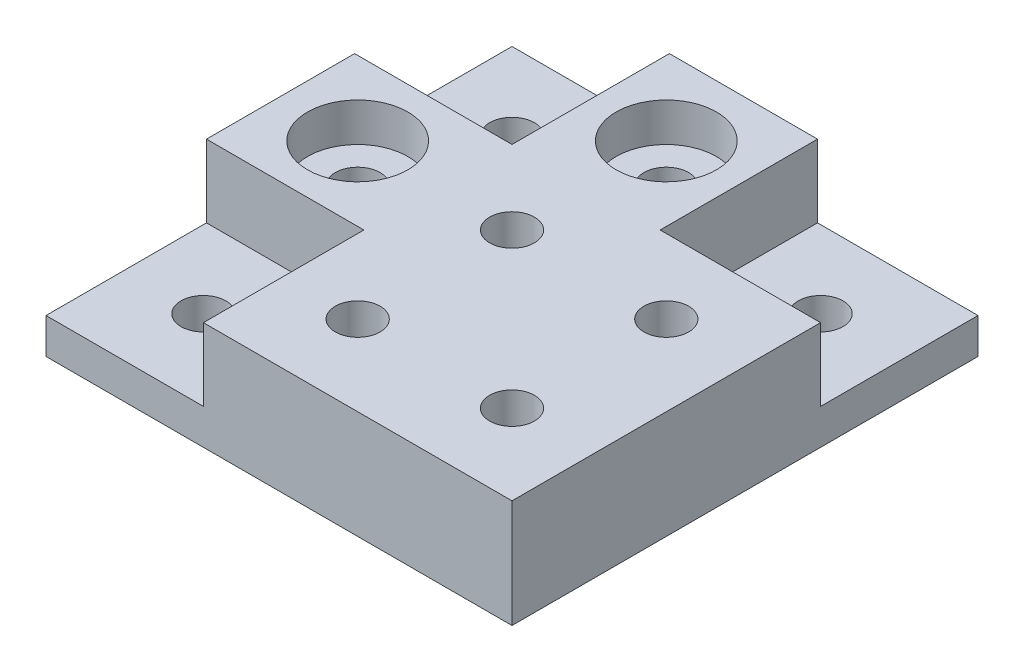
ISO-10303-21;
HEADER;
FILE_DESCRIPTION(('STEP AP214'),'2;1');
FILE_NAME('part.step','',(''),(''),'','','');
FILE_SCHEMA(('AUTOMOTIVE_DESIGN { 1 0 10303 214 1 1 1 1 }'));
ENDSEC;
DATA;
#1=APPLICATION_CONTEXT('core data for automotive mechanical design processes');
#2=APPLICATION_PROTOCOL_DEFINITION('international standard','automotive_design',2000,#1);
#3=PRODUCT_CONTEXT('',#1,'mechanical');
#4=PRODUCT('Part','Part','',(#3));
#5=PRODUCT_RELATED_PRODUCT_CATEGORY('part','',(#4));
#6=PRODUCT_DEFINITION_FORMATION('','',#4);
#7=PRODUCT_DEFINITION_CONTEXT('part definition',#1,'design');
#8=PRODUCT_DEFINITION('design','',#6,#7);
#9=PRODUCT_DEFINITION_SHAPE('','',#8);
#10=(LENGTH_UNIT() NAMED_UNIT(*) SI_UNIT(.MILLI.,.METRE.));
#11=(NAMED_UNIT(*) PLANE_ANGLE_UNIT() SI_UNIT($,.RADIAN.));
#12=(NAMED_UNIT(*) SI_UNIT($,.STERADIAN.) SOLID_ANGLE_UNIT());
#13=UNCERTAINTY_MEASURE_WITH_UNIT(LENGTH_MEASURE(1.E-05),#10,'distance_accuracy_value','');
#14=(GEOMETRIC_REPRESENTATION_CONTEXT(3) GLOBAL_UNCERTAINTY_ASSIGNED_CONTEXT((#13)) GLOBAL_UNIT_ASSIGNED_CONTEXT((#10,
#11,#12)) REPRESENTATION_CONTEXT('',''));
#15=CARTESIAN_POINT('',(0.,0.,0.));
#16=DIRECTION('',(0.,0.,1.));
#17=DIRECTION('',(1.,0.,0.));
#18=AXIS2_PLACEMENT_3D('',#15,#16,#17);
#19=CARTESIAN_POINT('',(-35.,0.,-45.));
#20=DIRECTION('',(0.,1.,0.));
#21=DIRECTION('',(0.,0.,1.));
#22=AXIS2_PLACEMENT_3D('',#19,#20,#21);
#23=CYLINDRICAL_SURFACE('',#22,1.45);
#24=CARTESIAN_POINT('',(-35.,0.,-45.));
#25=DIRECTION('',(0.,1.,0.));
#26=DIRECTION('',(0.,0.,1.));
#27=AXIS2_PLACEMENT_3D('',#24,#25,#26);
#28=CIRCLE('',#27,1.45);
#29=CARTESIAN_POINT('',(-35.,0.,-43.55));
#30=VERTEX_POINT('',#29);
#31=EDGE_CURVE('E187',#30,#30,#28,.T.);
#32=ORIENTED_EDGE('',*,*,#31,.F.);
#33=EDGE_LOOP('',(#32));
#34=FACE_BOUND('',#33,.T.);
#35=CARTESIAN_POINT('',(-35.,4.5,-45.));
#36=DIRECTION('',(0.,1.,0.));
#37=DIRECTION('',(0.,0.,1.));
#38=AXIS2_PLACEMENT_3D('',#35,#36,#37);
#39=CIRCLE('',#38,1.45);
#40=CARTESIAN_POINT('',(-35.,4.5,-43.55));
#41=VERTEX_POINT('',#40);
#42=EDGE_CURVE('E43',#41,#41,#39,.F.);
#43=ORIENTED_EDGE('',*,*,#42,.F.);
#44=EDGE_LOOP('',(#43));
#45=FACE_BOUND('',#44,.T.);
#46=ADVANCED_FACE('F39',(#34,#45),#23,.F.);
#47=CARTESIAN_POINT('',(-44.9999999999999,0.,-35.));
#48=DIRECTION('',(0.,1.,0.));
#49=DIRECTION('',(0.,0.,1.));
#50=AXIS2_PLACEMENT_3D('',#47,#48,#49);
#51=CYLINDRICAL_SURFACE('',#50,1.45);
#52=CARTESIAN_POINT('',(-44.9999999999999,0.,-35.));
#53=DIRECTION('',(0.,1.,0.));
#54=DIRECTION('',(0.,0.,1.));
#55=AXIS2_PLACEMENT_3D('',#52,#53,#54);
#56=CIRCLE('',#55,1.45);
#57=CARTESIAN_POINT('',(-44.9999999999999,0.,-33.55));
#58=VERTEX_POINT('',#57);
#59=EDGE_CURVE('E206',#58,#58,#56,.T.);
#60=ORIENTED_EDGE('',*,*,#59,.F.);
#61=EDGE_LOOP('',(#60));
#62=FACE_BOUND('',#61,.T.);
#63=CARTESIAN_POINT('',(-44.9999999999999,4.5,-35.));
#64=DIRECTION('',(0.,1.,0.));
#65=DIRECTION('',(0.,0.,1.));
#66=AXIS2_PLACEMENT_3D('',#63,#64,#65);
#67=CIRCLE('',#66,1.45);
#68=CARTESIAN_POINT('',(-44.9999999999999,4.5,-33.55));
#69=VERTEX_POINT('',#68);
#70=EDGE_CURVE('E181',#69,#69,#67,.F.);
#71=ORIENTED_EDGE('',*,*,#70,.F.);
#72=EDGE_LOOP('',(#71));
#73=FACE_BOUND('',#72,.T.);
#74=ADVANCED_FACE('F313',(#62,#73),#51,.F.);
#75=CARTESIAN_POINT('',(-50.,7.,-50.));
#76=DIRECTION('',(0.,0.,1.));
#77=DIRECTION('',(1.,0.,0.));
#78=AXIS2_PLACEMENT_3D('',#75,#76,#77);
#79=PLANE('',#78);
#80=DIRECTION('',(-1.,0.,0.));
#81=VECTOR('',#80,1.);
#82=CARTESIAN_POINT('',(-50.,2.3,-50.));
#83=LINE('',#82,#81);
#84=CARTESIAN_POINT('',(-19.8,2.3,-50.));
#85=VERTEX_POINT('',#84);
#86=CARTESIAN_POINT('',(-30.2,2.3,-50.));
#87=VERTEX_POINT('',#86);
#88=EDGE_CURVE('E11',#85,#87,#83,.T.);
#89=ORIENTED_EDGE('',*,*,#88,.F.);
#90=DIRECTION('',(0.,1.,0.));
#91=VECTOR('',#90,1.);
#92=CARTESIAN_POINT('',(-19.8,-8.,-50.));
#93=LINE('',#92,#91);
#94=CARTESIAN_POINT('',(-19.8,0.,-50.));
#95=VERTEX_POINT('',#94);
#96=EDGE_CURVE('E148',#95,#85,#93,.T.);
#97=ORIENTED_EDGE('',*,*,#96,.F.);
#98=DIRECTION('',(-1.,0.,0.));
#99=VECTOR('',#98,1.);
#100=CARTESIAN_POINT('',(-50.,0.,-50.));
#101=LINE('',#100,#99);
#102=CARTESIAN_POINT('',(-50.,0.,-50.));
#103=VERTEX_POINT('',#102);
#104=EDGE_CURVE('E275',#95,#103,#101,.T.);
#105=ORIENTED_EDGE('',*,*,#104,.T.);
#106=DIRECTION('',(0.,-1.,0.));
#107=VECTOR('',#106,1.);
#108=CARTESIAN_POINT('',(-50.,7.,-50.));
#109=LINE('',#108,#107);
#110=CARTESIAN_POINT('',(-50.,2.3,-50.));
#111=VERTEX_POINT('',#110);
#112=EDGE_CURVE('E283',#111,#103,#109,.T.);
#113=ORIENTED_EDGE('',*,*,#112,.F.);
#114=DIRECTION('',(-1.,0.,0.));
#115=VECTOR('',#114,1.);
#116=CARTESIAN_POINT('',(-50.,2.3,-50.));
#117=LINE('',#116,#115);
#118=CARTESIAN_POINT('',(-39.8,2.3,-50.));
#119=VERTEX_POINT('',#118);
#120=EDGE_CURVE('E273',#119,#111,#117,.T.);
#121=ORIENTED_EDGE('',*,*,#120,.F.);
#122=DIRECTION('',(0.,1.,0.));
#123=VECTOR('',#122,1.);
#124=CARTESIAN_POINT('',(-39.8,7.,-50.));
#125=LINE('',#124,#123);
#126=CARTESIAN_POINT('',(-39.8,7.,-50.));
#127=VERTEX_POINT('',#126);
#128=EDGE_CURVE('E264',#119,#127,#125,.T.);
#129=ORIENTED_EDGE('',*,*,#128,.T.);
#130=DIRECTION('',(-1.,0.,0.));
#131=VECTOR('',#130,1.);
#132=CARTESIAN_POINT('',(-50.,7.,-50.));
#133=LINE('',#132,#131);
#134=CARTESIAN_POINT('',(-30.2,7.,-50.));
#135=VERTEX_POINT('',#134);
#136=EDGE_CURVE('E276',#135,#127,#133,.T.);
#137=ORIENTED_EDGE('',*,*,#136,.F.);
#138=DIRECTION('',(0.,-1.,0.));
#139=VECTOR('',#138,1.);
#140=CARTESIAN_POINT('',(-30.2,7.,-50.));
#141=LINE('',#140,#139);
#142=EDGE_CURVE('E267',#135,#87,#141,.T.);
#143=ORIENTED_EDGE('',*,*,#142,.T.);
#144=EDGE_LOOP('',(#89,#97,#105,#113,#121,#129,#137,#143));
#145=FACE_BOUND('',#144,.T.);
#146=ADVANCED_FACE('F41',(#145),#79,.F.);
#147=CARTESIAN_POINT('',(-50.,7.,50.));
#148=DIRECTION('',(1.,0.,0.));
#149=DIRECTION('',(0.,0.,-1.));
#150=AXIS2_PLACEMENT_3D('',#147,#148,#149);
#151=PLANE('',#150);
#152=DIRECTION('',(0.,0.,1.));
#153=VECTOR('',#152,1.);
#154=CARTESIAN_POINT('',(-50.,0.,50.));
#155=LINE('',#154,#153);
#156=CARTESIAN_POINT('',(-50.,0.,-19.8));
#157=VERTEX_POINT('',#156);
#158=EDGE_CURVE('E280',#103,#157,#155,.T.);
#159=ORIENTED_EDGE('',*,*,#158,.T.);
#160=DIRECTION('',(0.,1.,0.));
#161=VECTOR('',#160,1.);
#162=CARTESIAN_POINT('',(-50.,-8.,-19.8));
#163=LINE('',#162,#161);
#164=CARTESIAN_POINT('',(-50.,2.3,-19.8));
#165=VERTEX_POINT('',#164);
#166=EDGE_CURVE('E147',#157,#165,#163,.T.);
#167=ORIENTED_EDGE('',*,*,#166,.T.);
#168=DIRECTION('',(0.,0.,1.));
#169=VECTOR('',#168,1.);
#170=CARTESIAN_POINT('',(-50.,2.3,50.));
#171=LINE('',#170,#169);
#172=CARTESIAN_POINT('',(-50.,2.3,-30.2));
#173=VERTEX_POINT('',#172);
#174=EDGE_CURVE('E48',#173,#165,#171,.T.);
#175=ORIENTED_EDGE('',*,*,#174,.F.);
#176=DIRECTION('',(0.,1.,0.));
#177=VECTOR('',#176,1.);
#178=CARTESIAN_POINT('',(-50.,7.,-30.2));
#179=LINE('',#178,#177);
#180=CARTESIAN_POINT('',(-50.,7.,-30.2));
#181=VERTEX_POINT('',#180);
#182=EDGE_CURVE('E270',#173,#181,#179,.T.);
#183=ORIENTED_EDGE('',*,*,#182,.T.);
#184=DIRECTION('',(0.,0.,1.));
#185=VECTOR('',#184,1.);
#186=CARTESIAN_POINT('',(-50.,7.,50.));
#187=LINE('',#186,#185);
#188=CARTESIAN_POINT('',(-50.,7.,-39.8));
#189=VERTEX_POINT('',#188);
#190=EDGE_CURVE('E279',#189,#181,#187,.T.);
#191=ORIENTED_EDGE('',*,*,#190,.F.);
#192=DIRECTION('',(0.,-1.,0.));
#193=VECTOR('',#192,1.);
#194=CARTESIAN_POINT('',(-50.,7.,-39.8));
#195=LINE('',#194,#193);
#196=CARTESIAN_POINT('',(-50.,2.3,-39.8));
#197=VERTEX_POINT('',#196);
#198=EDGE_CURVE('E64',#189,#197,#195,.T.);
#199=ORIENTED_EDGE('',*,*,#198,.T.);
#200=DIRECTION('',(0.,0.,1.));
#201=VECTOR('',#200,1.);
#202=CARTESIAN_POINT('',(-50.,2.3,50.));
#203=LINE('',#202,#201);
#204=EDGE_CURVE('E294',#111,#197,#203,.T.);
#205=ORIENTED_EDGE('',*,*,#204,.F.);
#206=ORIENTED_EDGE('',*,*,#112,.T.);
#207=EDGE_LOOP('',(#159,#167,#175,#183,#191,#199,#205,#206));
#208=FACE_BOUND('',#207,.T.);
#209=ADVANCED_FACE('F382',(#208),#151,.F.);
#210=CARTESIAN_POINT('',(0.,7.,0.));
#211=DIRECTION('',(0.,-1.,0.));
#212=DIRECTION('',(0.,0.,-1.));
#213=AXIS2_PLACEMENT_3D('',#210,#211,#212);
#214=PLANE('',#213);
#215=CARTESIAN_POINT('',(-44.9999999999999,7.,-35.));
#216=DIRECTION('',(0.,1.,0.));
#217=DIRECTION('',(0.,0.,1.));
#218=AXIS2_PLACEMENT_3D('',#215,#216,#217);
#219=CIRCLE('',#218,3.25);
#220=CARTESIAN_POINT('',(-44.9999999999999,7.,-31.75));
#221=VERTEX_POINT('',#220);
#222=EDGE_CURVE('E172',#221,#221,#219,.T.);
#223=ORIENTED_EDGE('',*,*,#222,.F.);
#224=EDGE_LOOP('',(#223));
#225=FACE_BOUND('',#224,.T.);
#226=CARTESIAN_POINT('',(-35.,7.,-45.));
#227=DIRECTION('',(0.,1.,0.));
#228=DIRECTION('',(0.,0.,1.));
#229=AXIS2_PLACEMENT_3D('',#226,#227,#228);
#230=CIRCLE('',#229,3.25);
#231=CARTESIAN_POINT('',(-35.,7.,-41.75));
#232=VERTEX_POINT('',#231);
#233=EDGE_CURVE('E178',#232,#232,#230,.T.);
#234=ORIENTED_EDGE('',*,*,#233,.F.);
#235=EDGE_LOOP('',(#234));
#236=FACE_BOUND('',#235,.T.);
#237=CARTESIAN_POINT('',(-34.9999999999998,7.,-25.));
#238=DIRECTION('',(0.,1.,0.));
#239=DIRECTION('',(0.,0.,1.));
#240=AXIS2_PLACEMENT_3D('',#237,#238,#239);
#241=CIRCLE('',#240,1.45);
#242=CARTESIAN_POINT('',(-34.9999999999998,7.,-23.55));
#243=VERTEX_POINT('',#242);
#244=EDGE_CURVE('E210',#243,#243,#241,.T.);
#245=ORIENTED_EDGE('',*,*,#244,.F.);
#246=EDGE_LOOP('',(#245));
#247=FACE_BOUND('',#246,.T.);
#248=CARTESIAN_POINT('',(-24.9999999999998,7.,-25.));
#249=DIRECTION('',(0.,1.,0.));
#250=DIRECTION('',(0.,0.,1.));
#251=AXIS2_PLACEMENT_3D('',#248,#249,#250);
#252=CIRCLE('',#251,1.45);
#253=CARTESIAN_POINT('',(-24.9999999999998,7.,-23.55));
#254=VERTEX_POINT('',#253);
#255=EDGE_CURVE('E203',#254,#254,#252,.T.);
#256=ORIENTED_EDGE('',*,*,#255,.F.);
#257=EDGE_LOOP('',(#256));
#258=FACE_BOUND('',#257,.T.);
#259=CARTESIAN_POINT('',(-34.9999999999999,7.,-35.));
#260=DIRECTION('',(0.,1.,0.));
#261=DIRECTION('',(0.,0.,1.));
#262=AXIS2_PLACEMENT_3D('',#259,#260,#261);
#263=CIRCLE('',#262,1.45);
#264=CARTESIAN_POINT('',(-34.9999999999999,7.,-33.55));
#265=VERTEX_POINT('',#264);
#266=EDGE_CURVE('E191',#265,#265,#263,.T.);
#267=ORIENTED_EDGE('',*,*,#266,.F.);
#268=EDGE_LOOP('',(#267));
#269=FACE_BOUND('',#268,.T.);
#270=CARTESIAN_POINT('',(-24.9999999999999,7.,-35.));
#271=DIRECTION('',(0.,1.,0.));
#272=DIRECTION('',(0.,0.,1.));
#273=AXIS2_PLACEMENT_3D('',#270,#271,#272);
#274=CIRCLE('',#273,1.45);
#275=CARTESIAN_POINT('',(-24.9999999999999,7.,-33.55));
#276=VERTEX_POINT('',#275);
#277=EDGE_CURVE('E184',#276,#276,#274,.T.);
#278=ORIENTED_EDGE('',*,*,#277,.F.);
#279=EDGE_LOOP('',(#278));
#280=FACE_BOUND('',#279,.T.);
#281=DIRECTION('',(0.,0.,-1.));
#282=VECTOR('',#281,1.);
#283=CARTESIAN_POINT('',(-39.7999999999998,7.,-30.2));
#284=LINE('',#283,#282);
#285=CARTESIAN_POINT('',(-39.7999999999998,7.,-19.8));
#286=VERTEX_POINT('',#285);
#287=CARTESIAN_POINT('',(-39.7999999999998,7.,-30.2));
#288=VERTEX_POINT('',#287);
#289=EDGE_CURVE('E162',#286,#288,#284,.T.);
#290=ORIENTED_EDGE('',*,*,#289,.F.);
#291=DIRECTION('',(-1.,0.,0.));
#292=VECTOR('',#291,1.);
#293=CARTESIAN_POINT('',(-50.,7.,-19.8));
#294=LINE('',#293,#292);
#295=CARTESIAN_POINT('',(-19.8,7.,-19.8));
#296=VERTEX_POINT('',#295);
#297=EDGE_CURVE('E141',#296,#286,#294,.T.);
#298=ORIENTED_EDGE('',*,*,#297,.F.);
#299=DIRECTION('',(0.,0.,1.));
#300=VECTOR('',#299,1.);
#301=CARTESIAN_POINT('',(-19.8,7.,-50.));
#302=LINE('',#301,#300);
#303=CARTESIAN_POINT('',(-19.8,7.,-39.8));
#304=VERTEX_POINT('',#303);
#305=EDGE_CURVE('E151',#304,#296,#302,.T.);
#306=ORIENTED_EDGE('',*,*,#305,.F.);
#307=DIRECTION('',(1.,0.,0.));
#308=VECTOR('',#307,1.);
#309=CARTESIAN_POINT('',(-30.2,7.,-39.8));
#310=LINE('',#309,#308);
#311=CARTESIAN_POINT('',(-30.2,7.,-39.8));
#312=VERTEX_POINT('',#311);
#313=EDGE_CURVE('E227',#312,#304,#310,.T.);
#314=ORIENTED_EDGE('',*,*,#313,.F.);
#315=DIRECTION('',(0.,0.,-1.));
#316=VECTOR('',#315,1.);
#317=CARTESIAN_POINT('',(-30.2,7.,0.));
#318=LINE('',#317,#316);
#319=EDGE_CURVE('E291',#312,#135,#318,.T.);
#320=ORIENTED_EDGE('',*,*,#319,.T.);
#321=ORIENTED_EDGE('',*,*,#136,.T.);
#322=DIRECTION('',(0.,0.,-1.));
#323=VECTOR('',#322,1.);
#324=CARTESIAN_POINT('',(-39.8,7.,-50.2));
#325=LINE('',#324,#323);
#326=CARTESIAN_POINT('',(-39.8,7.,-39.8));
#327=VERTEX_POINT('',#326);
#328=EDGE_CURVE('E229',#327,#127,#325,.T.);
#329=ORIENTED_EDGE('',*,*,#328,.F.);
#330=DIRECTION('',(-1.,0.,0.));
#331=VECTOR('',#330,1.);
#332=CARTESIAN_POINT('',(0.,7.,-39.8));
#333=LINE('',#332,#331);
#334=EDGE_CURVE('E289',#327,#189,#333,.T.);
#335=ORIENTED_EDGE('',*,*,#334,.T.);
#336=ORIENTED_EDGE('',*,*,#190,.T.);
#337=DIRECTION('',(-1.,0.,0.));
#338=VECTOR('',#337,1.);
#339=CARTESIAN_POINT('',(-50.1999999999998,7.,-30.2));
#340=LINE('',#339,#338);
#341=EDGE_CURVE('E243',#288,#181,#340,.T.);
#342=ORIENTED_EDGE('',*,*,#341,.F.);
#343=EDGE_LOOP('',(#290,#298,#306,#314,#320,#321,#329,#335,#336,#342));
#344=FACE_BOUND('',#343,.T.);
#345=ADVANCED_FACE('F159',(#225,#236,#247,#258,#269,#280,#344),#214,.F.);
#346=CARTESIAN_POINT('',(0.,0.,0.));
#347=DIRECTION('',(0.,-1.,0.));
#348=DIRECTION('',(0.,0.,-1.));
#349=AXIS2_PLACEMENT_3D('',#346,#347,#348);
#350=PLANE('',#349);
#351=DIRECTION('',(1.,0.,0.));
#352=VECTOR('',#351,1.);
#353=CARTESIAN_POINT('',(0.,0.,-19.8));
#354=LINE('',#353,#352);
#355=CARTESIAN_POINT('',(-19.8,0.,-19.8));
#356=VERTEX_POINT('',#355);
#357=EDGE_CURVE('E144',#157,#356,#354,.T.);
#358=ORIENTED_EDGE('',*,*,#357,.F.);
#359=ORIENTED_EDGE('',*,*,#158,.F.);
#360=ORIENTED_EDGE('',*,*,#104,.F.);
#361=DIRECTION('',(0.,0.,-1.));
#362=VECTOR('',#361,1.);
#363=CARTESIAN_POINT('',(-19.8,0.,0.));
#364=LINE('',#363,#362);
#365=EDGE_CURVE('E169',#356,#95,#364,.T.);
#366=ORIENTED_EDGE('',*,*,#365,.F.);
#367=EDGE_LOOP('',(#358,#359,#360,#366));
#368=FACE_BOUND('',#367,.T.);
#369=CARTESIAN_POINT('',(-34.9999999999998,0.,-25.));
#370=DIRECTION('',(0.,1.,0.));
#371=DIRECTION('',(0.,0.,1.));
#372=AXIS2_PLACEMENT_3D('',#369,#370,#371);
#373=CIRCLE('',#372,1.45);
#374=CARTESIAN_POINT('',(-34.9999999999998,0.,-23.55));
#375=VERTEX_POINT('',#374);
#376=EDGE_CURVE('E200',#375,#375,#373,.T.);
#377=ORIENTED_EDGE('',*,*,#376,.T.);
#378=EDGE_LOOP('',(#377));
#379=FACE_BOUND('',#378,.T.);
#380=CARTESIAN_POINT('',(-24.9999999999998,0.,-25.));
#381=DIRECTION('',(0.,1.,0.));
#382=DIRECTION('',(0.,0.,1.));
#383=AXIS2_PLACEMENT_3D('',#380,#381,#382);
#384=CIRCLE('',#383,1.45);
#385=CARTESIAN_POINT('',(-24.9999999999998,0.,-23.55));
#386=VERTEX_POINT('',#385);
#387=EDGE_CURVE('E207',#386,#386,#384,.T.);
#388=ORIENTED_EDGE('',*,*,#387,.T.);
#389=EDGE_LOOP('',(#388));
#390=FACE_BOUND('',#389,.T.);
#391=CARTESIAN_POINT('',(-44.9999999999998,0.,-25.));
#392=DIRECTION('',(0.,1.,0.));
#393=DIRECTION('',(0.,0.,1.));
#394=AXIS2_PLACEMENT_3D('',#391,#392,#393);
#395=CIRCLE('',#394,1.45);
#396=CARTESIAN_POINT('',(-44.9999999999998,0.,-23.55));
#397=VERTEX_POINT('',#396);
#398=EDGE_CURVE('E215',#397,#397,#395,.T.);
#399=ORIENTED_EDGE('',*,*,#398,.T.);
#400=EDGE_LOOP('',(#399));
#401=FACE_BOUND('',#400,.T.);
#402=ORIENTED_EDGE('',*,*,#59,.T.);
#403=EDGE_LOOP('',(#402));
#404=FACE_BOUND('',#403,.T.);
#405=CARTESIAN_POINT('',(-25.,0.,-45.));
#406=DIRECTION('',(0.,1.,0.));
#407=DIRECTION('',(0.,0.,1.));
#408=AXIS2_PLACEMENT_3D('',#405,#406,#407);
#409=CIRCLE('',#408,1.45);
#410=CARTESIAN_POINT('',(-25.,0.,-43.55));
#411=VERTEX_POINT('',#410);
#412=EDGE_CURVE('E197',#411,#411,#409,.T.);
#413=ORIENTED_EDGE('',*,*,#412,.T.);
#414=EDGE_LOOP('',(#413));
#415=FACE_BOUND('',#414,.T.);
#416=ORIENTED_EDGE('',*,*,#31,.T.);
#417=EDGE_LOOP('',(#416));
#418=FACE_BOUND('',#417,.T.);
#419=CARTESIAN_POINT('',(-34.9999999999999,0.,-35.));
#420=DIRECTION('',(0.,1.,0.));
#421=DIRECTION('',(0.,0.,1.));
#422=AXIS2_PLACEMENT_3D('',#419,#420,#421);
#423=CIRCLE('',#422,1.45);
#424=CARTESIAN_POINT('',(-34.9999999999999,0.,-33.55));
#425=VERTEX_POINT('',#424);
#426=EDGE_CURVE('E194',#425,#425,#423,.T.);
#427=ORIENTED_EDGE('',*,*,#426,.T.);
#428=EDGE_LOOP('',(#427));
#429=FACE_BOUND('',#428,.T.);
#430=CARTESIAN_POINT('',(-24.9999999999999,0.,-35.));
#431=DIRECTION('',(0.,1.,0.));
#432=DIRECTION('',(0.,0.,1.));
#433=AXIS2_PLACEMENT_3D('',#430,#431,#432);
#434=CIRCLE('',#433,1.45);
#435=CARTESIAN_POINT('',(-24.9999999999999,0.,-33.55));
#436=VERTEX_POINT('',#435);
#437=EDGE_CURVE('E188',#436,#436,#434,.T.);
#438=ORIENTED_EDGE('',*,*,#437,.T.);
#439=EDGE_LOOP('',(#438));
#440=FACE_BOUND('',#439,.T.);
#441=CARTESIAN_POINT('',(-45.,0.,-45.));
#442=DIRECTION('',(0.,1.,0.));
#443=DIRECTION('',(0.,0.,1.));
#444=AXIS2_PLACEMENT_3D('',#441,#442,#443);
#445=CIRCLE('',#444,1.45);
#446=CARTESIAN_POINT('',(-45.,0.,-43.55));
#447=VERTEX_POINT('',#446);
#448=EDGE_CURVE('E218',#447,#447,#445,.T.);
#449=ORIENTED_EDGE('',*,*,#448,.T.);
#450=EDGE_LOOP('',(#449));
#451=FACE_BOUND('',#450,.T.);
#452=ADVANCED_FACE('F373',(#368,#379,#390,#401,#404,#415,#418,#429,#440,#451),#350,.T.);
#453=CARTESIAN_POINT('',(0.,2.3,0.));
#454=DIRECTION('',(0.,1.,0.));
#455=DIRECTION('',(0.,0.,1.));
#456=AXIS2_PLACEMENT_3D('',#453,#454,#455);
#457=PLANE('',#456);
#458=CARTESIAN_POINT('',(-45.,2.3,-45.));
#459=DIRECTION('',(0.,1.,0.));
#460=DIRECTION('',(0.,0.,1.));
#461=AXIS2_PLACEMENT_3D('',#458,#459,#460);
#462=CIRCLE('',#461,1.45);
#463=CARTESIAN_POINT('',(-45.,2.3,-43.55));
#464=VERTEX_POINT('',#463);
#465=EDGE_CURVE('E242',#464,#464,#462,.T.);
#466=ORIENTED_EDGE('',*,*,#465,.F.);
#467=EDGE_LOOP('',(#466));
#468=FACE_BOUND('',#467,.T.);
#469=ORIENTED_EDGE('',*,*,#120,.T.);
#470=ORIENTED_EDGE('',*,*,#204,.T.);
#471=DIRECTION('',(1.,0.,0.));
#472=VECTOR('',#471,1.);
#473=CARTESIAN_POINT('',(-50.2,2.3,-39.8));
#474=LINE('',#473,#472);
#475=CARTESIAN_POINT('',(-39.8,2.3,-39.8));
#476=VERTEX_POINT('',#475);
#477=EDGE_CURVE('E254',#197,#476,#474,.T.);
#478=ORIENTED_EDGE('',*,*,#477,.T.);
#479=DIRECTION('',(0.,0.,-1.));
#480=VECTOR('',#479,1.);
#481=CARTESIAN_POINT('',(-39.8,2.3,-50.2));
#482=LINE('',#481,#480);
#483=EDGE_CURVE('E256',#476,#119,#482,.T.);
#484=ORIENTED_EDGE('',*,*,#483,.T.);
#485=EDGE_LOOP('',(#469,#470,#478,#484));
#486=FACE_BOUND('',#485,.T.);
#487=ADVANCED_FACE('F369',(#468,#486),#457,.T.);
#488=CARTESIAN_POINT('',(-39.8,2.3,-50.2));
#489=DIRECTION('',(1.,0.,0.));
#490=DIRECTION('',(0.,0.,-1.));
#491=AXIS2_PLACEMENT_3D('',#488,#489,#490);
#492=PLANE('',#491);
#493=ORIENTED_EDGE('',*,*,#483,.F.);
#494=DIRECTION('',(0.,1.,0.));
#495=VECTOR('',#494,1.);
#496=CARTESIAN_POINT('',(-39.8,2.3,-39.8));
#497=LINE('',#496,#495);
#498=EDGE_CURVE('E259',#476,#327,#497,.T.);
#499=ORIENTED_EDGE('',*,*,#498,.T.);
#500=ORIENTED_EDGE('',*,*,#328,.T.);
#501=ORIENTED_EDGE('',*,*,#128,.F.);
#502=EDGE_LOOP('',(#493,#499,#500,#501));
#503=FACE_BOUND('',#502,.T.);
#504=ADVANCED_FACE('F372',(#503),#492,.F.);
#505=CARTESIAN_POINT('',(-50.2,2.3,-39.8));
#506=DIRECTION('',(0.,0.,1.));
#507=DIRECTION('',(1.,0.,0.));
#508=AXIS2_PLACEMENT_3D('',#505,#506,#507);
#509=PLANE('',#508);
#510=ORIENTED_EDGE('',*,*,#334,.F.);
#511=ORIENTED_EDGE('',*,*,#498,.F.);
#512=ORIENTED_EDGE('',*,*,#477,.F.);
#513=ORIENTED_EDGE('',*,*,#198,.F.);
#514=EDGE_LOOP('',(#510,#511,#512,#513));
#515=FACE_BOUND('',#514,.T.);
#516=ADVANCED_FACE('F357',(#515),#509,.F.);
#517=CARTESIAN_POINT('',(0.,2.3,0.));
#518=DIRECTION('',(0.,1.,0.));
#519=DIRECTION('',(0.,0.,1.));
#520=AXIS2_PLACEMENT_3D('',#517,#518,#519);
#521=PLANE('',#520);
#522=CARTESIAN_POINT('',(-25.,2.3,-45.));
#523=DIRECTION('',(0.,1.,0.));
#524=DIRECTION('',(0.,0.,1.));
#525=AXIS2_PLACEMENT_3D('',#522,#523,#524);
#526=CIRCLE('',#525,1.45);
#527=CARTESIAN_POINT('',(-25.,2.3,-43.55));
#528=VERTEX_POINT('',#527);
#529=EDGE_CURVE('E300',#528,#528,#526,.T.);
#530=ORIENTED_EDGE('',*,*,#529,.F.);
#531=EDGE_LOOP('',(#530));
#532=FACE_BOUND('',#531,.T.);
#533=ORIENTED_EDGE('',*,*,#88,.T.);
#534=DIRECTION('',(0.,0.,1.));
#535=VECTOR('',#534,1.);
#536=CARTESIAN_POINT('',(-30.2,2.3,-50.2));
#537=LINE('',#536,#535);
#538=CARTESIAN_POINT('',(-30.2,2.3,-39.8));
#539=VERTEX_POINT('',#538);
#540=EDGE_CURVE('E230',#87,#539,#537,.T.);
#541=ORIENTED_EDGE('',*,*,#540,.T.);
#542=DIRECTION('',(1.,0.,0.));
#543=VECTOR('',#542,1.);
#544=CARTESIAN_POINT('',(-30.2,2.3,-39.8));
#545=LINE('',#544,#543);
#546=CARTESIAN_POINT('',(-19.8,2.3,-39.8));
#547=VERTEX_POINT('',#546);
#548=EDGE_CURVE('E233',#539,#547,#545,.T.);
#549=ORIENTED_EDGE('',*,*,#548,.T.);
#550=DIRECTION('',(0.,0.,-1.));
#551=VECTOR('',#550,1.);
#552=CARTESIAN_POINT('',(-19.8,2.3,-50.2));
#553=LINE('',#552,#551);
#554=EDGE_CURVE('E225',#547,#85,#553,.T.);
#555=ORIENTED_EDGE('',*,*,#554,.T.);
#556=EDGE_LOOP('',(#533,#541,#549,#555));
#557=FACE_BOUND('',#556,.T.);
#558=ADVANCED_FACE('F350',(#532,#557),#521,.T.);
#559=CARTESIAN_POINT('',(-30.2,2.3,-50.2));
#560=DIRECTION('',(-1.,0.,0.));
#561=DIRECTION('',(0.,0.,1.));
#562=AXIS2_PLACEMENT_3D('',#559,#560,#561);
#563=PLANE('',#562);
#564=ORIENTED_EDGE('',*,*,#319,.F.);
#565=DIRECTION('',(0.,1.,0.));
#566=VECTOR('',#565,1.);
#567=CARTESIAN_POINT('',(-30.2,2.3,-39.8));
#568=LINE('',#567,#566);
#569=EDGE_CURVE('E56',#539,#312,#568,.T.);
#570=ORIENTED_EDGE('',*,*,#569,.F.);
#571=ORIENTED_EDGE('',*,*,#540,.F.);
#572=ORIENTED_EDGE('',*,*,#142,.F.);
#573=EDGE_LOOP('',(#564,#570,#571,#572));
#574=FACE_BOUND('',#573,.T.);
#575=ADVANCED_FACE('F346',(#574),#563,.F.);
#576=CARTESIAN_POINT('',(-30.2,2.3,-39.8));
#577=DIRECTION('',(0.,0.,1.));
#578=DIRECTION('',(1.,0.,0.));
#579=AXIS2_PLACEMENT_3D('',#576,#577,#578);
#580=PLANE('',#579);
#581=ORIENTED_EDGE('',*,*,#313,.T.);
#582=DIRECTION('',(0.,1.,0.));
#583=VECTOR('',#582,1.);
#584=CARTESIAN_POINT('',(-19.8,2.3,-39.8));
#585=LINE('',#584,#583);
#586=EDGE_CURVE('E154',#547,#304,#585,.T.);
#587=ORIENTED_EDGE('',*,*,#586,.F.);
#588=ORIENTED_EDGE('',*,*,#548,.F.);
#589=ORIENTED_EDGE('',*,*,#569,.T.);
#590=EDGE_LOOP('',(#581,#587,#588,#589));
#591=FACE_BOUND('',#590,.T.);
#592=ADVANCED_FACE('F349',(#591),#580,.F.);
#593=CARTESIAN_POINT('',(0.,2.3,0.));
#594=DIRECTION('',(0.,1.,0.));
#595=DIRECTION('',(0.,0.,1.));
#596=AXIS2_PLACEMENT_3D('',#593,#594,#595);
#597=PLANE('',#596);
#598=CARTESIAN_POINT('',(-44.9999999999998,2.3,-25.));
#599=DIRECTION('',(0.,1.,0.));
#600=DIRECTION('',(0.,0.,1.));
#601=AXIS2_PLACEMENT_3D('',#598,#599,#600);
#602=CIRCLE('',#601,1.45);
#603=CARTESIAN_POINT('',(-44.9999999999998,2.3,-23.55));
#604=VERTEX_POINT('',#603);
#605=EDGE_CURVE('E223',#604,#604,#602,.T.);
#606=ORIENTED_EDGE('',*,*,#605,.F.);
#607=EDGE_LOOP('',(#606));
#608=FACE_BOUND('',#607,.T.);
#609=ORIENTED_EDGE('',*,*,#174,.T.);
#610=DIRECTION('',(1.,0.,0.));
#611=VECTOR('',#610,1.);
#612=CARTESIAN_POINT('',(-50.1999999999998,2.3,-19.8));
#613=LINE('',#612,#611);
#614=CARTESIAN_POINT('',(-39.7999999999998,2.3,-19.8));
#615=VERTEX_POINT('',#614);
#616=EDGE_CURVE('E245',#165,#615,#613,.T.);
#617=ORIENTED_EDGE('',*,*,#616,.T.);
#618=DIRECTION('',(0.,0.,-1.));
#619=VECTOR('',#618,1.);
#620=CARTESIAN_POINT('',(-39.7999999999998,2.3,-30.2));
#621=LINE('',#620,#619);
#622=CARTESIAN_POINT('',(-39.7999999999998,2.3,-30.2));
#623=VERTEX_POINT('',#622);
#624=EDGE_CURVE('E249',#615,#623,#621,.T.);
#625=ORIENTED_EDGE('',*,*,#624,.T.);
#626=DIRECTION('',(-1.,0.,0.));
#627=VECTOR('',#626,1.);
#628=CARTESIAN_POINT('',(-50.1999999999998,2.3,-30.2));
#629=LINE('',#628,#627);
#630=EDGE_CURVE('E239',#623,#173,#629,.T.);
#631=ORIENTED_EDGE('',*,*,#630,.T.);
#632=EDGE_LOOP('',(#609,#617,#625,#631));
#633=FACE_BOUND('',#632,.T.);
#634=ADVANCED_FACE('F354',(#608,#633),#597,.T.);
#635=CARTESIAN_POINT('',(-50.1999999999998,2.3,-30.2));
#636=DIRECTION('',(0.,0.,-1.));
#637=DIRECTION('',(-1.,0.,0.));
#638=AXIS2_PLACEMENT_3D('',#635,#636,#637);
#639=PLANE('',#638);
#640=ORIENTED_EDGE('',*,*,#630,.F.);
#641=DIRECTION('',(0.,1.,0.));
#642=VECTOR('',#641,1.);
#643=CARTESIAN_POINT('',(-39.7999999999998,2.3,-30.2));
#644=LINE('',#643,#642);
#645=EDGE_CURVE('E240',#623,#288,#644,.T.);
#646=ORIENTED_EDGE('',*,*,#645,.T.);
#647=ORIENTED_EDGE('',*,*,#341,.T.);
#648=ORIENTED_EDGE('',*,*,#182,.F.);
#649=EDGE_LOOP('',(#640,#646,#647,#648));
#650=FACE_BOUND('',#649,.T.);
#651=ADVANCED_FACE('F361',(#650),#639,.F.);
#652=CARTESIAN_POINT('',(-39.7999999999998,2.3,-30.2));
#653=DIRECTION('',(1.,0.,0.));
#654=DIRECTION('',(0.,0.,-1.));
#655=AXIS2_PLACEMENT_3D('',#652,#653,#654);
#656=PLANE('',#655);
#657=ORIENTED_EDGE('',*,*,#289,.T.);
#658=ORIENTED_EDGE('',*,*,#645,.F.);
#659=ORIENTED_EDGE('',*,*,#624,.F.);
#660=DIRECTION('',(0.,1.,0.));
#661=VECTOR('',#660,1.);
#662=CARTESIAN_POINT('',(-39.7999999999998,2.3,-19.8));
#663=LINE('',#662,#661);
#664=EDGE_CURVE('E237',#615,#286,#663,.T.);
#665=ORIENTED_EDGE('',*,*,#664,.T.);
#666=EDGE_LOOP('',(#657,#658,#659,#665));
#667=FACE_BOUND('',#666,.T.);
#668=ADVANCED_FACE('F338',(#667),#656,.F.);
#669=CARTESIAN_POINT('',(-44.9999999999998,0.,-25.));
#670=DIRECTION('',(0.,1.,0.));
#671=DIRECTION('',(0.,0.,1.));
#672=AXIS2_PLACEMENT_3D('',#669,#670,#671);
#673=CYLINDRICAL_SURFACE('',#672,1.45);
#674=ORIENTED_EDGE('',*,*,#605,.T.);
#675=EDGE_LOOP('',(#674));
#676=FACE_BOUND('',#675,.T.);
#677=ORIENTED_EDGE('',*,*,#398,.F.);
#678=EDGE_LOOP('',(#677));
#679=FACE_BOUND('',#678,.T.);
#680=ADVANCED_FACE('F336',(#676,#679),#673,.F.);
#681=CARTESIAN_POINT('',(-25.,0.,-45.));
#682=DIRECTION('',(0.,1.,0.));
#683=DIRECTION('',(0.,0.,1.));
#684=AXIS2_PLACEMENT_3D('',#681,#682,#683);
#685=CYLINDRICAL_SURFACE('',#684,1.45);
#686=ORIENTED_EDGE('',*,*,#529,.T.);
#687=EDGE_LOOP('',(#686));
#688=FACE_BOUND('',#687,.T.);
#689=ORIENTED_EDGE('',*,*,#412,.F.);
#690=EDGE_LOOP('',(#689));
#691=FACE_BOUND('',#690,.T.);
#692=ADVANCED_FACE('F325',(#688,#691),#685,.F.);
#693=CARTESIAN_POINT('',(-45.,0.,-45.));
#694=DIRECTION('',(0.,1.,0.));
#695=DIRECTION('',(0.,0.,1.));
#696=AXIS2_PLACEMENT_3D('',#693,#694,#695);
#697=CYLINDRICAL_SURFACE('',#696,1.45);
#698=ORIENTED_EDGE('',*,*,#465,.T.);
#699=EDGE_LOOP('',(#698));
#700=FACE_BOUND('',#699,.T.);
#701=ORIENTED_EDGE('',*,*,#448,.F.);
#702=EDGE_LOOP('',(#701));
#703=FACE_BOUND('',#702,.T.);
#704=ADVANCED_FACE('F341',(#700,#703),#697,.F.);
#705=CARTESIAN_POINT('',(-24.9999999999999,0.,-35.));
#706=DIRECTION('',(0.,1.,0.));
#707=DIRECTION('',(0.,0.,1.));
#708=AXIS2_PLACEMENT_3D('',#705,#706,#707);
#709=CYLINDRICAL_SURFACE('',#708,1.45);
#710=ORIENTED_EDGE('',*,*,#437,.F.);
#711=EDGE_LOOP('',(#710));
#712=FACE_BOUND('',#711,.T.);
#713=ORIENTED_EDGE('',*,*,#277,.T.);
#714=EDGE_LOOP('',(#713));
#715=FACE_BOUND('',#714,.T.);
#716=ADVANCED_FACE('F344',(#712,#715),#709,.F.);
#717=CARTESIAN_POINT('',(-34.9999999999999,0.,-35.));
#718=DIRECTION('',(0.,1.,0.));
#719=DIRECTION('',(0.,0.,1.));
#720=AXIS2_PLACEMENT_3D('',#717,#718,#719);
#721=CYLINDRICAL_SURFACE('',#720,1.45);
#722=ORIENTED_EDGE('',*,*,#426,.F.);
#723=EDGE_LOOP('',(#722));
#724=FACE_BOUND('',#723,.T.);
#725=ORIENTED_EDGE('',*,*,#266,.T.);
#726=EDGE_LOOP('',(#725));
#727=FACE_BOUND('',#726,.T.);
#728=ADVANCED_FACE('F331',(#724,#727),#721,.F.);
#729=CARTESIAN_POINT('',(-24.9999999999998,0.,-25.));
#730=DIRECTION('',(0.,1.,0.));
#731=DIRECTION('',(0.,0.,1.));
#732=AXIS2_PLACEMENT_3D('',#729,#730,#731);
#733=CYLINDRICAL_SURFACE('',#732,1.45);
#734=ORIENTED_EDGE('',*,*,#387,.F.);
#735=EDGE_LOOP('',(#734));
#736=FACE_BOUND('',#735,.T.);
#737=ORIENTED_EDGE('',*,*,#255,.T.);
#738=EDGE_LOOP('',(#737));
#739=FACE_BOUND('',#738,.T.);
#740=ADVANCED_FACE('F327',(#736,#739),#733,.F.);
#741=CARTESIAN_POINT('',(-34.9999999999998,0.,-25.));
#742=DIRECTION('',(0.,1.,0.));
#743=DIRECTION('',(0.,0.,1.));
#744=AXIS2_PLACEMENT_3D('',#741,#742,#743);
#745=CYLINDRICAL_SURFACE('',#744,1.45);
#746=ORIENTED_EDGE('',*,*,#376,.F.);
#747=EDGE_LOOP('',(#746));
#748=FACE_BOUND('',#747,.T.);
#749=ORIENTED_EDGE('',*,*,#244,.T.);
#750=EDGE_LOOP('',(#749));
#751=FACE_BOUND('',#750,.T.);
#752=ADVANCED_FACE('F330',(#748,#751),#745,.F.);
#753=CARTESIAN_POINT('',(-44.9999999999999,4.5,-35.));
#754=DIRECTION('',(0.,1.,0.));
#755=DIRECTION('',(0.,0.,1.));
#756=AXIS2_PLACEMENT_3D('',#753,#754,#755);
#757=PLANE('',#756);
#758=CARTESIAN_POINT('',(-44.9999999999999,4.5,-35.));
#759=DIRECTION('',(0.,1.,0.));
#760=DIRECTION('',(0.,0.,1.));
#761=AXIS2_PLACEMENT_3D('',#758,#759,#760);
#762=CIRCLE('',#761,3.25);
#763=CARTESIAN_POINT('',(-44.9999999999999,4.5,-31.75));
#764=VERTEX_POINT('',#763);
#765=EDGE_CURVE('E171',#764,#764,#762,.T.);
#766=ORIENTED_EDGE('',*,*,#765,.T.);
#767=EDGE_LOOP('',(#766));
#768=FACE_BOUND('',#767,.T.);
#769=ORIENTED_EDGE('',*,*,#70,.T.);
#770=EDGE_LOOP('',(#769));
#771=FACE_BOUND('',#770,.T.);
#772=ADVANCED_FACE('F334',(#768,#771),#757,.T.);
#773=CARTESIAN_POINT('',(-44.9999999999999,4.5,-35.));
#774=DIRECTION('',(0.,1.,0.));
#775=DIRECTION('',(0.,0.,1.));
#776=AXIS2_PLACEMENT_3D('',#773,#774,#775);
#777=CYLINDRICAL_SURFACE('',#776,3.25);
#778=ORIENTED_EDGE('',*,*,#765,.F.);
#779=EDGE_LOOP('',(#778));
#780=FACE_BOUND('',#779,.T.);
#781=ORIENTED_EDGE('',*,*,#222,.T.);
#782=EDGE_LOOP('',(#781));
#783=FACE_BOUND('',#782,.T.);
#784=ADVANCED_FACE('F443',(#780,#783),#777,.F.);
#785=CARTESIAN_POINT('',(-35.,4.5,-45.));
#786=DIRECTION('',(0.,1.,0.));
#787=DIRECTION('',(0.,0.,1.));
#788=AXIS2_PLACEMENT_3D('',#785,#786,#787);
#789=PLANE('',#788);
#790=CARTESIAN_POINT('',(-35.,4.5,-45.));
#791=DIRECTION('',(0.,1.,0.));
#792=DIRECTION('',(0.,0.,1.));
#793=AXIS2_PLACEMENT_3D('',#790,#791,#792);
#794=CIRCLE('',#793,3.25);
#795=CARTESIAN_POINT('',(-35.,4.5,-41.75));
#796=VERTEX_POINT('',#795);
#797=EDGE_CURVE('E175',#796,#796,#794,.T.);
#798=ORIENTED_EDGE('',*,*,#797,.T.);
#799=EDGE_LOOP('',(#798));
#800=FACE_BOUND('',#799,.T.);
#801=ORIENTED_EDGE('',*,*,#42,.T.);
#802=EDGE_LOOP('',(#801));
#803=FACE_BOUND('',#802,.T.);
#804=ADVANCED_FACE('F310',(#800,#803),#789,.T.);
#805=CARTESIAN_POINT('',(-35.,4.5,-45.));
#806=DIRECTION('',(0.,1.,0.));
#807=DIRECTION('',(0.,0.,1.));
#808=AXIS2_PLACEMENT_3D('',#805,#806,#807);
#809=CYLINDRICAL_SURFACE('',#808,3.25);
#810=ORIENTED_EDGE('',*,*,#797,.F.);
#811=EDGE_LOOP('',(#810));
#812=FACE_BOUND('',#811,.T.);
#813=ORIENTED_EDGE('',*,*,#233,.T.);
#814=EDGE_LOOP('',(#813));
#815=FACE_BOUND('',#814,.T.);
#816=ADVANCED_FACE('F442',(#812,#815),#809,.F.);
#817=CARTESIAN_POINT('',(-50.,-8.,-19.8));
#818=DIRECTION('',(0.,0.,-1.));
#819=DIRECTION('',(-1.,0.,0.));
#820=AXIS2_PLACEMENT_3D('',#817,#818,#819);
#821=PLANE('',#820);
#822=ORIENTED_EDGE('',*,*,#357,.T.);
#823=DIRECTION('',(0.,1.,0.));
#824=VECTOR('',#823,1.);
#825=CARTESIAN_POINT('',(-19.8,-8.,-19.8));
#826=LINE('',#825,#824);
#827=EDGE_CURVE('E137',#356,#296,#826,.T.);
#828=ORIENTED_EDGE('',*,*,#827,.T.);
#829=ORIENTED_EDGE('',*,*,#297,.T.);
#830=ORIENTED_EDGE('',*,*,#664,.F.);
#831=ORIENTED_EDGE('',*,*,#616,.F.);
#832=ORIENTED_EDGE('',*,*,#166,.F.);
#833=EDGE_LOOP('',(#822,#828,#829,#830,#831,#832));
#834=FACE_BOUND('',#833,.T.);
#835=ADVANCED_FACE('F139',(#834),#821,.F.);
#836=CARTESIAN_POINT('',(-19.8,-8.,-50.));
#837=DIRECTION('',(-1.,0.,0.));
#838=DIRECTION('',(0.,0.,1.));
#839=AXIS2_PLACEMENT_3D('',#836,#837,#838);
#840=PLANE('',#839);
#841=ORIENTED_EDGE('',*,*,#365,.T.);
#842=ORIENTED_EDGE('',*,*,#96,.T.);
#843=ORIENTED_EDGE('',*,*,#554,.F.);
#844=ORIENTED_EDGE('',*,*,#586,.T.);
#845=ORIENTED_EDGE('',*,*,#305,.T.);
#846=ORIENTED_EDGE('',*,*,#827,.F.);
#847=EDGE_LOOP('',(#841,#842,#843,#844,#845,#846));
#848=FACE_BOUND('',#847,.T.);
#849=ADVANCED_FACE('F152',(#848),#840,.F.);
#850=CLOSED_SHELL('',(#46,#74,#146,#209,#345,#452,#487,#504,#516,#558,#575,#592,#634,#651,#668,
#680,#692,#704,#716,#728,#740,#752,#772,#784,#804,#816,#835,#849));
#851=MANIFOLD_SOLID_BREP('B2',#850);
#852=ADVANCED_BREP_SHAPE_REPRESENTATION('',(#18,#851),#14);
#853=SHAPE_DEFINITION_REPRESENTATION(#9,#852);
ENDSEC;
END-ISO-10303-21;
